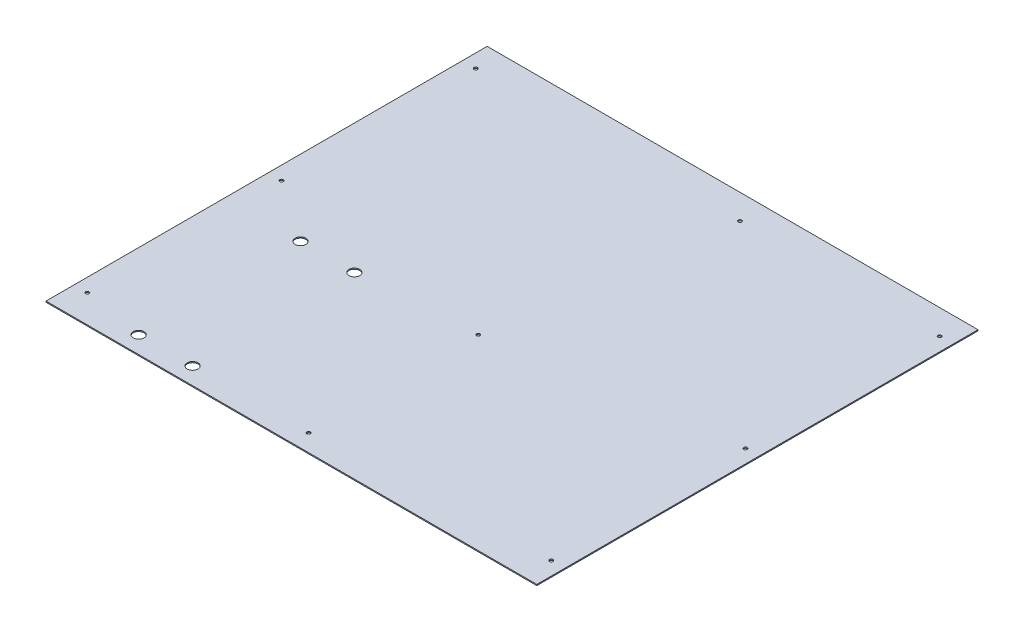
ISO-10303-21;
HEADER;
FILE_DESCRIPTION(('STEP AP214'),'2;1');
FILE_NAME('part.step','',(''),(''),'','','');
FILE_SCHEMA(('AUTOMOTIVE_DESIGN { 1 0 10303 214 1 1 1 1 }'));
ENDSEC;
DATA;
#1=APPLICATION_CONTEXT('core data for automotive mechanical design processes');
#2=APPLICATION_PROTOCOL_DEFINITION('international standard','automotive_design',2000,#1);
#3=PRODUCT_CONTEXT('',#1,'mechanical');
#4=PRODUCT('Part','Part','',(#3));
#5=PRODUCT_RELATED_PRODUCT_CATEGORY('part','',(#4));
#6=PRODUCT_DEFINITION_FORMATION('','',#4);
#7=PRODUCT_DEFINITION_CONTEXT('part definition',#1,'design');
#8=PRODUCT_DEFINITION('design','',#6,#7);
#9=PRODUCT_DEFINITION_SHAPE('','',#8);
#10=(LENGTH_UNIT() NAMED_UNIT(*) SI_UNIT(.MILLI.,.METRE.));
#11=(NAMED_UNIT(*) PLANE_ANGLE_UNIT() SI_UNIT($,.RADIAN.));
#12=(NAMED_UNIT(*) SI_UNIT($,.STERADIAN.) SOLID_ANGLE_UNIT());
#13=UNCERTAINTY_MEASURE_WITH_UNIT(LENGTH_MEASURE(1.E-05),#10,'distance_accuracy_value','');
#14=(GEOMETRIC_REPRESENTATION_CONTEXT(3) GLOBAL_UNCERTAINTY_ASSIGNED_CONTEXT((#13)) GLOBAL_UNIT_ASSIGNED_CONTEXT((#10,
#11,#12)) REPRESENTATION_CONTEXT('',''));
#15=CARTESIAN_POINT('',(0.,0.,0.));
#16=DIRECTION('',(0.,0.,1.));
#17=DIRECTION('',(1.,0.,0.));
#18=AXIS2_PLACEMENT_3D('',#15,#16,#17);
#19=CARTESIAN_POINT('',(227.5,1.,204.5));
#20=DIRECTION('',(-1.,0.,0.));
#21=DIRECTION('',(0.,0.,1.));
#22=AXIS2_PLACEMENT_3D('',#19,#20,#21);
#23=PLANE('',#22);
#24=DIRECTION('',(0.,0.,-1.));
#25=VECTOR('',#24,1.);
#26=CARTESIAN_POINT('',(227.5,0.,204.5));
#27=LINE('',#26,#25);
#28=CARTESIAN_POINT('',(227.5,0.,204.5));
#29=VERTEX_POINT('',#28);
#30=CARTESIAN_POINT('',(227.5,0.,-204.5));
#31=VERTEX_POINT('',#30);
#32=EDGE_CURVE('E100',#29,#31,#27,.T.);
#33=ORIENTED_EDGE('',*,*,#32,.T.);
#34=DIRECTION('',(0.,-1.,0.));
#35=VECTOR('',#34,1.);
#36=CARTESIAN_POINT('',(227.5,1.,-204.5));
#37=LINE('',#36,#35);
#38=CARTESIAN_POINT('',(227.5,1.,-204.5));
#39=VERTEX_POINT('',#38);
#40=EDGE_CURVE('E11',#39,#31,#37,.T.);
#41=ORIENTED_EDGE('',*,*,#40,.F.);
#42=DIRECTION('',(0.,0.,-1.));
#43=VECTOR('',#42,1.);
#44=CARTESIAN_POINT('',(227.5,1.,204.5));
#45=LINE('',#44,#43);
#46=CARTESIAN_POINT('',(227.5,1.,204.5));
#47=VERTEX_POINT('',#46);
#48=EDGE_CURVE('E88',#47,#39,#45,.T.);
#49=ORIENTED_EDGE('',*,*,#48,.F.);
#50=DIRECTION('',(0.,-1.,0.));
#51=VECTOR('',#50,1.);
#52=CARTESIAN_POINT('',(227.5,1.,204.5));
#53=LINE('',#52,#51);
#54=EDGE_CURVE('E96',#47,#29,#53,.T.);
#55=ORIENTED_EDGE('',*,*,#54,.T.);
#56=EDGE_LOOP('',(#33,#41,#49,#55));
#57=FACE_BOUND('',#56,.T.);
#58=ADVANCED_FACE('F37',(#57),#23,.F.);
#59=CARTESIAN_POINT('',(-227.5,1.,-204.5));
#60=DIRECTION('',(0.,0.,1.));
#61=DIRECTION('',(1.,0.,0.));
#62=AXIS2_PLACEMENT_3D('',#59,#60,#61);
#63=PLANE('',#62);
#64=DIRECTION('',(-1.,0.,0.));
#65=VECTOR('',#64,1.);
#66=CARTESIAN_POINT('',(-227.5,0.,-204.5));
#67=LINE('',#66,#65);
#68=CARTESIAN_POINT('',(-227.5,0.,-204.5));
#69=VERTEX_POINT('',#68);
#70=EDGE_CURVE('E92',#31,#69,#67,.T.);
#71=ORIENTED_EDGE('',*,*,#70,.T.);
#72=DIRECTION('',(0.,-1.,0.));
#73=VECTOR('',#72,1.);
#74=CARTESIAN_POINT('',(-227.5,1.,-204.5));
#75=LINE('',#74,#73);
#76=CARTESIAN_POINT('',(-227.5,1.,-204.5));
#77=VERTEX_POINT('',#76);
#78=EDGE_CURVE('E45',#77,#69,#75,.T.);
#79=ORIENTED_EDGE('',*,*,#78,.F.);
#80=DIRECTION('',(-1.,0.,0.));
#81=VECTOR('',#80,1.);
#82=CARTESIAN_POINT('',(-227.5,1.,-204.5));
#83=LINE('',#82,#81);
#84=EDGE_CURVE('E83',#39,#77,#83,.T.);
#85=ORIENTED_EDGE('',*,*,#84,.F.);
#86=ORIENTED_EDGE('',*,*,#40,.T.);
#87=EDGE_LOOP('',(#71,#79,#85,#86));
#88=FACE_BOUND('',#87,.T.);
#89=ADVANCED_FACE('F91',(#88),#63,.F.);
#90=CARTESIAN_POINT('',(-227.5,1.,204.5));
#91=DIRECTION('',(1.,0.,0.));
#92=DIRECTION('',(0.,0.,-1.));
#93=AXIS2_PLACEMENT_3D('',#90,#91,#92);
#94=PLANE('',#93);
#95=DIRECTION('',(0.,0.,1.));
#96=VECTOR('',#95,1.);
#97=CARTESIAN_POINT('',(-227.5,0.,204.5));
#98=LINE('',#97,#96);
#99=CARTESIAN_POINT('',(-227.5,0.,204.5));
#100=VERTEX_POINT('',#99);
#101=EDGE_CURVE('E70',#69,#100,#98,.T.);
#102=ORIENTED_EDGE('',*,*,#101,.T.);
#103=DIRECTION('',(0.,-1.,0.));
#104=VECTOR('',#103,1.);
#105=CARTESIAN_POINT('',(-227.5,1.,204.5));
#106=LINE('',#105,#104);
#107=CARTESIAN_POINT('',(-227.5,1.,204.5));
#108=VERTEX_POINT('',#107);
#109=EDGE_CURVE('E93',#108,#100,#106,.T.);
#110=ORIENTED_EDGE('',*,*,#109,.F.);
#111=DIRECTION('',(0.,0.,1.));
#112=VECTOR('',#111,1.);
#113=CARTESIAN_POINT('',(-227.5,1.,204.5));
#114=LINE('',#113,#112);
#115=EDGE_CURVE('E86',#77,#108,#114,.T.);
#116=ORIENTED_EDGE('',*,*,#115,.F.);
#117=ORIENTED_EDGE('',*,*,#78,.T.);
#118=EDGE_LOOP('',(#102,#110,#116,#117));
#119=FACE_BOUND('',#118,.T.);
#120=ADVANCED_FACE('F94',(#119),#94,.F.);
#121=CARTESIAN_POINT('',(-227.5,1.,204.5));
#122=DIRECTION('',(0.,0.,-1.));
#123=DIRECTION('',(-1.,0.,0.));
#124=AXIS2_PLACEMENT_3D('',#121,#122,#123);
#125=PLANE('',#124);
#126=DIRECTION('',(1.,0.,0.));
#127=VECTOR('',#126,1.);
#128=CARTESIAN_POINT('',(-227.5,0.,204.5));
#129=LINE('',#128,#127);
#130=EDGE_CURVE('E76',#100,#29,#129,.T.);
#131=ORIENTED_EDGE('',*,*,#130,.T.);
#132=ORIENTED_EDGE('',*,*,#54,.F.);
#133=DIRECTION('',(1.,0.,0.));
#134=VECTOR('',#133,1.);
#135=CARTESIAN_POINT('',(-227.5,1.,204.5));
#136=LINE('',#135,#134);
#137=EDGE_CURVE('E53',#108,#47,#136,.T.);
#138=ORIENTED_EDGE('',*,*,#137,.F.);
#139=ORIENTED_EDGE('',*,*,#109,.T.);
#140=EDGE_LOOP('',(#131,#132,#138,#139));
#141=FACE_BOUND('',#140,.T.);
#142=ADVANCED_FACE('F108',(#141),#125,.F.);
#143=CARTESIAN_POINT('',(0.,1.,0.));
#144=DIRECTION('',(0.,-1.,0.));
#145=DIRECTION('',(0.,0.,-1.));
#146=AXIS2_PLACEMENT_3D('',#143,#144,#145);
#147=PLANE('',#146);
#148=CARTESIAN_POINT('',(29.9999999999999,1.,-181.4));
#149=DIRECTION('',(0.,-1.,0.));
#150=DIRECTION('',(0.,0.,-1.));
#151=AXIS2_PLACEMENT_3D('',#148,#149,#150);
#152=CIRCLE('',#151,1.59999999999999);
#153=CARTESIAN_POINT('',(29.9999999999999,1.,-183.));
#154=VERTEX_POINT('',#153);
#155=EDGE_CURVE('E185',#154,#154,#152,.F.);
#156=ORIENTED_EDGE('',*,*,#155,.F.);
#157=EDGE_LOOP('',(#156));
#158=FACE_BOUND('',#157,.T.);
#159=CARTESIAN_POINT('',(0.,1.,188.6));
#160=DIRECTION('',(0.,-1.,0.));
#161=DIRECTION('',(0.,0.,-1.));
#162=AXIS2_PLACEMENT_3D('',#159,#160,#161);
#163=CIRCLE('',#162,1.59999999999999);
#164=CARTESIAN_POINT('',(0.,1.,187.));
#165=VERTEX_POINT('',#164);
#166=EDGE_CURVE('E179',#165,#165,#163,.F.);
#167=ORIENTED_EDGE('',*,*,#166,.F.);
#168=EDGE_LOOP('',(#167));
#169=FACE_BOUND('',#168,.T.);
#170=CARTESIAN_POINT('',(215.,1.,-1.39999999999992));
#171=DIRECTION('',(0.,-1.,0.));
#172=DIRECTION('',(0.,0.,-1.));
#173=AXIS2_PLACEMENT_3D('',#170,#171,#172);
#174=CIRCLE('',#173,1.59999999999999);
#175=CARTESIAN_POINT('',(215.,1.,-2.99999999999991));
#176=VERTEX_POINT('',#175);
#177=EDGE_CURVE('E173',#176,#176,#174,.F.);
#178=ORIENTED_EDGE('',*,*,#177,.F.);
#179=EDGE_LOOP('',(#178));
#180=FACE_BOUND('',#179,.T.);
#181=CARTESIAN_POINT('',(-215.,1.,-1.40000000000001));
#182=DIRECTION('',(0.,-1.,0.));
#183=DIRECTION('',(0.,0.,-1.));
#184=AXIS2_PLACEMENT_3D('',#181,#182,#183);
#185=CIRCLE('',#184,1.59999999999999);
#186=CARTESIAN_POINT('',(-215.,1.,-3.));
#187=VERTEX_POINT('',#186);
#188=EDGE_CURVE('E167',#187,#187,#185,.F.);
#189=ORIENTED_EDGE('',*,*,#188,.F.);
#190=EDGE_LOOP('',(#189));
#191=FACE_BOUND('',#190,.T.);
#192=CARTESIAN_POINT('',(-157.5,1.,188.6));
#193=DIRECTION('',(0.,-1.,0.));
#194=DIRECTION('',(0.,0.,-1.));
#195=AXIS2_PLACEMENT_3D('',#192,#193,#194);
#196=CIRCLE('',#195,4.99999999999999);
#197=CARTESIAN_POINT('',(-157.5,1.,183.6));
#198=VERTEX_POINT('',#197);
#199=EDGE_CURVE('E161',#198,#198,#196,.F.);
#200=ORIENTED_EDGE('',*,*,#199,.F.);
#201=EDGE_LOOP('',(#200));
#202=FACE_BOUND('',#201,.T.);
#203=CARTESIAN_POINT('',(-107.5,1.,188.6));
#204=DIRECTION('',(0.,-1.,0.));
#205=DIRECTION('',(0.,0.,-1.));
#206=AXIS2_PLACEMENT_3D('',#203,#204,#205);
#207=CIRCLE('',#206,5.00000000000001);
#208=CARTESIAN_POINT('',(-107.5,1.,183.6));
#209=VERTEX_POINT('',#208);
#210=EDGE_CURVE('E155',#209,#209,#207,.F.);
#211=ORIENTED_EDGE('',*,*,#210,.F.);
#212=EDGE_LOOP('',(#211));
#213=FACE_BOUND('',#212,.T.);
#214=CARTESIAN_POINT('',(-107.5,1.,38.6));
#215=DIRECTION('',(0.,-1.,0.));
#216=DIRECTION('',(0.,0.,-1.));
#217=AXIS2_PLACEMENT_3D('',#214,#215,#216);
#218=CIRCLE('',#217,5.00000000000001);
#219=CARTESIAN_POINT('',(-107.5,1.,33.6));
#220=VERTEX_POINT('',#219);
#221=EDGE_CURVE('E149',#220,#220,#218,.F.);
#222=ORIENTED_EDGE('',*,*,#221,.F.);
#223=EDGE_LOOP('',(#222));
#224=FACE_BOUND('',#223,.T.);
#225=CARTESIAN_POINT('',(-157.5,1.,38.6));
#226=DIRECTION('',(0.,-1.,0.));
#227=DIRECTION('',(0.,0.,-1.));
#228=AXIS2_PLACEMENT_3D('',#225,#226,#227);
#229=CIRCLE('',#228,4.99999999999999);
#230=CARTESIAN_POINT('',(-157.5,1.,33.6));
#231=VERTEX_POINT('',#230);
#232=EDGE_CURVE('E143',#231,#231,#229,.F.);
#233=ORIENTED_EDGE('',*,*,#232,.F.);
#234=EDGE_LOOP('',(#233));
#235=FACE_BOUND('',#234,.T.);
#236=CARTESIAN_POINT('',(0.,1.,31.25));
#237=DIRECTION('',(0.,-1.,0.));
#238=DIRECTION('',(0.,0.,-1.));
#239=AXIS2_PLACEMENT_3D('',#236,#237,#238);
#240=CIRCLE('',#239,1.6);
#241=CARTESIAN_POINT('',(0.,1.,29.65));
#242=VERTEX_POINT('',#241);
#243=EDGE_CURVE('E137',#242,#242,#240,.F.);
#244=ORIENTED_EDGE('',*,*,#243,.F.);
#245=EDGE_LOOP('',(#244));
#246=FACE_BOUND('',#245,.T.);
#247=CARTESIAN_POINT('',(215.,1.,178.6));
#248=DIRECTION('',(0.,-1.,0.));
#249=DIRECTION('',(0.,0.,-1.));
#250=AXIS2_PLACEMENT_3D('',#247,#248,#249);
#251=CIRCLE('',#250,1.59999999999999);
#252=CARTESIAN_POINT('',(215.,1.,177.));
#253=VERTEX_POINT('',#252);
#254=EDGE_CURVE('E131',#253,#253,#251,.F.);
#255=ORIENTED_EDGE('',*,*,#254,.F.);
#256=EDGE_LOOP('',(#255));
#257=FACE_BOUND('',#256,.T.);
#258=CARTESIAN_POINT('',(215.,1.,-181.4));
#259=DIRECTION('',(0.,-1.,0.));
#260=DIRECTION('',(0.,0.,-1.));
#261=AXIS2_PLACEMENT_3D('',#258,#259,#260);
#262=CIRCLE('',#261,1.59999999999999);
#263=CARTESIAN_POINT('',(215.,1.,-183.));
#264=VERTEX_POINT('',#263);
#265=EDGE_CURVE('E125',#264,#264,#262,.F.);
#266=ORIENTED_EDGE('',*,*,#265,.F.);
#267=EDGE_LOOP('',(#266));
#268=FACE_BOUND('',#267,.T.);
#269=CARTESIAN_POINT('',(-215.,1.,-181.4));
#270=DIRECTION('',(0.,-1.,0.));
#271=DIRECTION('',(0.,0.,-1.));
#272=AXIS2_PLACEMENT_3D('',#269,#270,#271);
#273=CIRCLE('',#272,1.59999999999999);
#274=CARTESIAN_POINT('',(-215.,1.,-183.));
#275=VERTEX_POINT('',#274);
#276=EDGE_CURVE('E119',#275,#275,#273,.F.);
#277=ORIENTED_EDGE('',*,*,#276,.F.);
#278=EDGE_LOOP('',(#277));
#279=FACE_BOUND('',#278,.T.);
#280=CARTESIAN_POINT('',(-215.,1.,178.6));
#281=DIRECTION('',(0.,-1.,0.));
#282=DIRECTION('',(0.,0.,-1.));
#283=AXIS2_PLACEMENT_3D('',#280,#281,#282);
#284=CIRCLE('',#283,1.59999999999999);
#285=CARTESIAN_POINT('',(-215.,1.,177.));
#286=VERTEX_POINT('',#285);
#287=EDGE_CURVE('E103',#286,#286,#284,.F.);
#288=ORIENTED_EDGE('',*,*,#287,.F.);
#289=EDGE_LOOP('',(#288));
#290=FACE_BOUND('',#289,.T.);
#291=ORIENTED_EDGE('',*,*,#48,.T.);
#292=ORIENTED_EDGE('',*,*,#84,.T.);
#293=ORIENTED_EDGE('',*,*,#115,.T.);
#294=ORIENTED_EDGE('',*,*,#137,.T.);
#295=EDGE_LOOP('',(#291,#292,#293,#294));
#296=FACE_BOUND('',#295,.T.);
#297=ADVANCED_FACE('F84',(#158,#169,#180,#191,#202,#213,#224,#235,#246,#257,#268,#279,#290,
#296),#147,.F.);
#298=CARTESIAN_POINT('',(0.,0.,0.));
#299=DIRECTION('',(0.,-1.,0.));
#300=DIRECTION('',(0.,0.,-1.));
#301=AXIS2_PLACEMENT_3D('',#298,#299,#300);
#302=PLANE('',#301);
#303=CARTESIAN_POINT('',(29.9999999999999,0.,-181.4));
#304=DIRECTION('',(0.,-1.,0.));
#305=DIRECTION('',(0.,0.,-1.));
#306=AXIS2_PLACEMENT_3D('',#303,#304,#305);
#307=CIRCLE('',#306,1.59999999999999);
#308=CARTESIAN_POINT('',(29.9999999999999,0.,-183.));
#309=VERTEX_POINT('',#308);
#310=EDGE_CURVE('E188',#309,#309,#307,.T.);
#311=ORIENTED_EDGE('',*,*,#310,.F.);
#312=EDGE_LOOP('',(#311));
#313=FACE_BOUND('',#312,.T.);
#314=CARTESIAN_POINT('',(0.,0.,188.6));
#315=DIRECTION('',(0.,-1.,0.));
#316=DIRECTION('',(0.,0.,-1.));
#317=AXIS2_PLACEMENT_3D('',#314,#315,#316);
#318=CIRCLE('',#317,1.59999999999999);
#319=CARTESIAN_POINT('',(0.,0.,187.));
#320=VERTEX_POINT('',#319);
#321=EDGE_CURVE('E182',#320,#320,#318,.T.);
#322=ORIENTED_EDGE('',*,*,#321,.F.);
#323=EDGE_LOOP('',(#322));
#324=FACE_BOUND('',#323,.T.);
#325=CARTESIAN_POINT('',(215.,0.,-1.39999999999992));
#326=DIRECTION('',(0.,-1.,0.));
#327=DIRECTION('',(0.,0.,-1.));
#328=AXIS2_PLACEMENT_3D('',#325,#326,#327);
#329=CIRCLE('',#328,1.59999999999999);
#330=CARTESIAN_POINT('',(215.,0.,-2.99999999999991));
#331=VERTEX_POINT('',#330);
#332=EDGE_CURVE('E176',#331,#331,#329,.T.);
#333=ORIENTED_EDGE('',*,*,#332,.F.);
#334=EDGE_LOOP('',(#333));
#335=FACE_BOUND('',#334,.T.);
#336=CARTESIAN_POINT('',(-215.,0.,-1.40000000000001));
#337=DIRECTION('',(0.,-1.,0.));
#338=DIRECTION('',(0.,0.,-1.));
#339=AXIS2_PLACEMENT_3D('',#336,#337,#338);
#340=CIRCLE('',#339,1.59999999999999);
#341=CARTESIAN_POINT('',(-215.,0.,-3.));
#342=VERTEX_POINT('',#341);
#343=EDGE_CURVE('E170',#342,#342,#340,.T.);
#344=ORIENTED_EDGE('',*,*,#343,.F.);
#345=EDGE_LOOP('',(#344));
#346=FACE_BOUND('',#345,.T.);
#347=CARTESIAN_POINT('',(-157.5,0.,188.6));
#348=DIRECTION('',(0.,-1.,0.));
#349=DIRECTION('',(0.,0.,-1.));
#350=AXIS2_PLACEMENT_3D('',#347,#348,#349);
#351=CIRCLE('',#350,4.99999999999999);
#352=CARTESIAN_POINT('',(-157.5,0.,183.6));
#353=VERTEX_POINT('',#352);
#354=EDGE_CURVE('E164',#353,#353,#351,.T.);
#355=ORIENTED_EDGE('',*,*,#354,.F.);
#356=EDGE_LOOP('',(#355));
#357=FACE_BOUND('',#356,.T.);
#358=CARTESIAN_POINT('',(-107.5,0.,188.6));
#359=DIRECTION('',(0.,-1.,0.));
#360=DIRECTION('',(0.,0.,-1.));
#361=AXIS2_PLACEMENT_3D('',#358,#359,#360);
#362=CIRCLE('',#361,5.00000000000001);
#363=CARTESIAN_POINT('',(-107.5,0.,183.6));
#364=VERTEX_POINT('',#363);
#365=EDGE_CURVE('E158',#364,#364,#362,.T.);
#366=ORIENTED_EDGE('',*,*,#365,.F.);
#367=EDGE_LOOP('',(#366));
#368=FACE_BOUND('',#367,.T.);
#369=CARTESIAN_POINT('',(-107.5,0.,38.6));
#370=DIRECTION('',(0.,-1.,0.));
#371=DIRECTION('',(0.,0.,-1.));
#372=AXIS2_PLACEMENT_3D('',#369,#370,#371);
#373=CIRCLE('',#372,5.00000000000001);
#374=CARTESIAN_POINT('',(-107.5,0.,33.6));
#375=VERTEX_POINT('',#374);
#376=EDGE_CURVE('E152',#375,#375,#373,.T.);
#377=ORIENTED_EDGE('',*,*,#376,.F.);
#378=EDGE_LOOP('',(#377));
#379=FACE_BOUND('',#378,.T.);
#380=CARTESIAN_POINT('',(-157.5,0.,38.6));
#381=DIRECTION('',(0.,-1.,0.));
#382=DIRECTION('',(0.,0.,-1.));
#383=AXIS2_PLACEMENT_3D('',#380,#381,#382);
#384=CIRCLE('',#383,4.99999999999999);
#385=CARTESIAN_POINT('',(-157.5,0.,33.6));
#386=VERTEX_POINT('',#385);
#387=EDGE_CURVE('E146',#386,#386,#384,.T.);
#388=ORIENTED_EDGE('',*,*,#387,.F.);
#389=EDGE_LOOP('',(#388));
#390=FACE_BOUND('',#389,.T.);
#391=CARTESIAN_POINT('',(0.,0.,31.25));
#392=DIRECTION('',(0.,-1.,0.));
#393=DIRECTION('',(0.,0.,-1.));
#394=AXIS2_PLACEMENT_3D('',#391,#392,#393);
#395=CIRCLE('',#394,1.6);
#396=CARTESIAN_POINT('',(0.,0.,29.65));
#397=VERTEX_POINT('',#396);
#398=EDGE_CURVE('E140',#397,#397,#395,.T.);
#399=ORIENTED_EDGE('',*,*,#398,.F.);
#400=EDGE_LOOP('',(#399));
#401=FACE_BOUND('',#400,.T.);
#402=CARTESIAN_POINT('',(215.,0.,178.6));
#403=DIRECTION('',(0.,-1.,0.));
#404=DIRECTION('',(0.,0.,-1.));
#405=AXIS2_PLACEMENT_3D('',#402,#403,#404);
#406=CIRCLE('',#405,1.59999999999999);
#407=CARTESIAN_POINT('',(215.,0.,177.));
#408=VERTEX_POINT('',#407);
#409=EDGE_CURVE('E134',#408,#408,#406,.T.);
#410=ORIENTED_EDGE('',*,*,#409,.F.);
#411=EDGE_LOOP('',(#410));
#412=FACE_BOUND('',#411,.T.);
#413=CARTESIAN_POINT('',(215.,0.,-181.4));
#414=DIRECTION('',(0.,-1.,0.));
#415=DIRECTION('',(0.,0.,-1.));
#416=AXIS2_PLACEMENT_3D('',#413,#414,#415);
#417=CIRCLE('',#416,1.59999999999999);
#418=CARTESIAN_POINT('',(215.,0.,-183.));
#419=VERTEX_POINT('',#418);
#420=EDGE_CURVE('E128',#419,#419,#417,.T.);
#421=ORIENTED_EDGE('',*,*,#420,.F.);
#422=EDGE_LOOP('',(#421));
#423=FACE_BOUND('',#422,.T.);
#424=CARTESIAN_POINT('',(-215.,0.,-181.4));
#425=DIRECTION('',(0.,-1.,0.));
#426=DIRECTION('',(0.,0.,-1.));
#427=AXIS2_PLACEMENT_3D('',#424,#425,#426);
#428=CIRCLE('',#427,1.59999999999999);
#429=CARTESIAN_POINT('',(-215.,0.,-183.));
#430=VERTEX_POINT('',#429);
#431=EDGE_CURVE('E122',#430,#430,#428,.T.);
#432=ORIENTED_EDGE('',*,*,#431,.F.);
#433=EDGE_LOOP('',(#432));
#434=FACE_BOUND('',#433,.T.);
#435=CARTESIAN_POINT('',(-215.,0.,178.6));
#436=DIRECTION('',(0.,-1.,0.));
#437=DIRECTION('',(0.,0.,-1.));
#438=AXIS2_PLACEMENT_3D('',#435,#436,#437);
#439=CIRCLE('',#438,1.59999999999999);
#440=CARTESIAN_POINT('',(-215.,0.,177.));
#441=VERTEX_POINT('',#440);
#442=EDGE_CURVE('E116',#441,#441,#439,.T.);
#443=ORIENTED_EDGE('',*,*,#442,.F.);
#444=EDGE_LOOP('',(#443));
#445=FACE_BOUND('',#444,.T.);
#446=ORIENTED_EDGE('',*,*,#32,.F.);
#447=ORIENTED_EDGE('',*,*,#130,.F.);
#448=ORIENTED_EDGE('',*,*,#101,.F.);
#449=ORIENTED_EDGE('',*,*,#70,.F.);
#450=EDGE_LOOP('',(#446,#447,#448,#449));
#451=FACE_BOUND('',#450,.T.);
#452=ADVANCED_FACE('F111',(#313,#324,#335,#346,#357,#368,#379,#390,#401,#412,#423,#434,#445,
#451),#302,.T.);
#453=CARTESIAN_POINT('',(-215.,1.001,178.6));
#454=DIRECTION('',(0.,-1.,0.));
#455=DIRECTION('',(0.,0.,-1.));
#456=AXIS2_PLACEMENT_3D('',#453,#454,#455);
#457=CYLINDRICAL_SURFACE('',#456,1.59999999999999);
#458=ORIENTED_EDGE('',*,*,#442,.T.);
#459=EDGE_LOOP('',(#458));
#460=FACE_BOUND('',#459,.T.);
#461=ORIENTED_EDGE('',*,*,#287,.T.);
#462=EDGE_LOOP('',(#461));
#463=FACE_BOUND('',#462,.T.);
#464=ADVANCED_FACE('F197',(#460,#463),#457,.F.);
#465=CARTESIAN_POINT('',(-215.,1.001,-181.4));
#466=DIRECTION('',(0.,-1.,0.));
#467=DIRECTION('',(0.,0.,-1.));
#468=AXIS2_PLACEMENT_3D('',#465,#466,#467);
#469=CYLINDRICAL_SURFACE('',#468,1.59999999999999);
#470=ORIENTED_EDGE('',*,*,#431,.T.);
#471=EDGE_LOOP('',(#470));
#472=FACE_BOUND('',#471,.T.);
#473=ORIENTED_EDGE('',*,*,#276,.T.);
#474=EDGE_LOOP('',(#473));
#475=FACE_BOUND('',#474,.T.);
#476=ADVANCED_FACE('F225',(#472,#475),#469,.F.);
#477=CARTESIAN_POINT('',(215.,1.001,-181.4));
#478=DIRECTION('',(0.,-1.,0.));
#479=DIRECTION('',(0.,0.,-1.));
#480=AXIS2_PLACEMENT_3D('',#477,#478,#479);
#481=CYLINDRICAL_SURFACE('',#480,1.59999999999999);
#482=ORIENTED_EDGE('',*,*,#420,.T.);
#483=EDGE_LOOP('',(#482));
#484=FACE_BOUND('',#483,.T.);
#485=ORIENTED_EDGE('',*,*,#265,.T.);
#486=EDGE_LOOP('',(#485));
#487=FACE_BOUND('',#486,.T.);
#488=ADVANCED_FACE('F269',(#484,#487),#481,.F.);
#489=CARTESIAN_POINT('',(215.,1.001,178.6));
#490=DIRECTION('',(0.,-1.,0.));
#491=DIRECTION('',(0.,0.,-1.));
#492=AXIS2_PLACEMENT_3D('',#489,#490,#491);
#493=CYLINDRICAL_SURFACE('',#492,1.59999999999999);
#494=ORIENTED_EDGE('',*,*,#409,.T.);
#495=EDGE_LOOP('',(#494));
#496=FACE_BOUND('',#495,.T.);
#497=ORIENTED_EDGE('',*,*,#254,.T.);
#498=EDGE_LOOP('',(#497));
#499=FACE_BOUND('',#498,.T.);
#500=ADVANCED_FACE('F279',(#496,#499),#493,.F.);
#501=CARTESIAN_POINT('',(0.,1.001,31.25));
#502=DIRECTION('',(0.,-1.,0.));
#503=DIRECTION('',(0.,0.,-1.));
#504=AXIS2_PLACEMENT_3D('',#501,#502,#503);
#505=CYLINDRICAL_SURFACE('',#504,1.6);
#506=ORIENTED_EDGE('',*,*,#398,.T.);
#507=EDGE_LOOP('',(#506));
#508=FACE_BOUND('',#507,.T.);
#509=ORIENTED_EDGE('',*,*,#243,.T.);
#510=EDGE_LOOP('',(#509));
#511=FACE_BOUND('',#510,.T.);
#512=ADVANCED_FACE('F289',(#508,#511),#505,.F.);
#513=CARTESIAN_POINT('',(-157.5,1.001,38.6));
#514=DIRECTION('',(0.,-1.,0.));
#515=DIRECTION('',(0.,0.,-1.));
#516=AXIS2_PLACEMENT_3D('',#513,#514,#515);
#517=CYLINDRICAL_SURFACE('',#516,4.99999999999999);
#518=ORIENTED_EDGE('',*,*,#387,.T.);
#519=EDGE_LOOP('',(#518));
#520=FACE_BOUND('',#519,.T.);
#521=ORIENTED_EDGE('',*,*,#232,.T.);
#522=EDGE_LOOP('',(#521));
#523=FACE_BOUND('',#522,.T.);
#524=ADVANCED_FACE('F299',(#520,#523),#517,.F.);
#525=CARTESIAN_POINT('',(-107.5,1.001,38.6));
#526=DIRECTION('',(0.,-1.,0.));
#527=DIRECTION('',(0.,0.,-1.));
#528=AXIS2_PLACEMENT_3D('',#525,#526,#527);
#529=CYLINDRICAL_SURFACE('',#528,5.00000000000001);
#530=ORIENTED_EDGE('',*,*,#376,.T.);
#531=EDGE_LOOP('',(#530));
#532=FACE_BOUND('',#531,.T.);
#533=ORIENTED_EDGE('',*,*,#221,.T.);
#534=EDGE_LOOP('',(#533));
#535=FACE_BOUND('',#534,.T.);
#536=ADVANCED_FACE('F309',(#532,#535),#529,.F.);
#537=CARTESIAN_POINT('',(-107.5,1.001,188.6));
#538=DIRECTION('',(0.,-1.,0.));
#539=DIRECTION('',(0.,0.,-1.));
#540=AXIS2_PLACEMENT_3D('',#537,#538,#539);
#541=CYLINDRICAL_SURFACE('',#540,5.00000000000001);
#542=ORIENTED_EDGE('',*,*,#365,.T.);
#543=EDGE_LOOP('',(#542));
#544=FACE_BOUND('',#543,.T.);
#545=ORIENTED_EDGE('',*,*,#210,.T.);
#546=EDGE_LOOP('',(#545));
#547=FACE_BOUND('',#546,.T.);
#548=ADVANCED_FACE('F319',(#544,#547),#541,.F.);
#549=CARTESIAN_POINT('',(-157.5,1.001,188.6));
#550=DIRECTION('',(0.,-1.,0.));
#551=DIRECTION('',(0.,0.,-1.));
#552=AXIS2_PLACEMENT_3D('',#549,#550,#551);
#553=CYLINDRICAL_SURFACE('',#552,4.99999999999999);
#554=ORIENTED_EDGE('',*,*,#354,.T.);
#555=EDGE_LOOP('',(#554));
#556=FACE_BOUND('',#555,.T.);
#557=ORIENTED_EDGE('',*,*,#199,.T.);
#558=EDGE_LOOP('',(#557));
#559=FACE_BOUND('',#558,.T.);
#560=ADVANCED_FACE('F329',(#556,#559),#553,.F.);
#561=CARTESIAN_POINT('',(-215.,1.001,-1.40000000000001));
#562=DIRECTION('',(0.,-1.,0.));
#563=DIRECTION('',(0.,0.,-1.));
#564=AXIS2_PLACEMENT_3D('',#561,#562,#563);
#565=CYLINDRICAL_SURFACE('',#564,1.59999999999999);
#566=ORIENTED_EDGE('',*,*,#343,.T.);
#567=EDGE_LOOP('',(#566));
#568=FACE_BOUND('',#567,.T.);
#569=ORIENTED_EDGE('',*,*,#188,.T.);
#570=EDGE_LOOP('',(#569));
#571=FACE_BOUND('',#570,.T.);
#572=ADVANCED_FACE('F338',(#568,#571),#565,.F.);
#573=CARTESIAN_POINT('',(215.,1.001,-1.39999999999992));
#574=DIRECTION('',(0.,-1.,0.));
#575=DIRECTION('',(0.,0.,-1.));
#576=AXIS2_PLACEMENT_3D('',#573,#574,#575);
#577=CYLINDRICAL_SURFACE('',#576,1.59999999999999);
#578=ORIENTED_EDGE('',*,*,#332,.T.);
#579=EDGE_LOOP('',(#578));
#580=FACE_BOUND('',#579,.T.);
#581=ORIENTED_EDGE('',*,*,#177,.T.);
#582=EDGE_LOOP('',(#581));
#583=FACE_BOUND('',#582,.T.);
#584=ADVANCED_FACE('F357',(#580,#583),#577,.F.);
#585=CARTESIAN_POINT('',(0.,1.001,188.6));
#586=DIRECTION('',(0.,-1.,0.));
#587=DIRECTION('',(0.,0.,-1.));
#588=AXIS2_PLACEMENT_3D('',#585,#586,#587);
#589=CYLINDRICAL_SURFACE('',#588,1.59999999999999);
#590=ORIENTED_EDGE('',*,*,#321,.T.);
#591=EDGE_LOOP('',(#590));
#592=FACE_BOUND('',#591,.T.);
#593=ORIENTED_EDGE('',*,*,#166,.T.);
#594=EDGE_LOOP('',(#593));
#595=FACE_BOUND('',#594,.T.);
#596=ADVANCED_FACE('F367',(#592,#595),#589,.F.);
#597=CARTESIAN_POINT('',(29.9999999999999,1.001,-181.4));
#598=DIRECTION('',(0.,-1.,0.));
#599=DIRECTION('',(0.,0.,-1.));
#600=AXIS2_PLACEMENT_3D('',#597,#598,#599);
#601=CYLINDRICAL_SURFACE('',#600,1.59999999999999);
#602=ORIENTED_EDGE('',*,*,#310,.T.);
#603=EDGE_LOOP('',(#602));
#604=FACE_BOUND('',#603,.T.);
#605=ORIENTED_EDGE('',*,*,#155,.T.);
#606=EDGE_LOOP('',(#605));
#607=FACE_BOUND('',#606,.T.);
#608=ADVANCED_FACE('F192',(#604,#607),#601,.F.);
#609=CLOSED_SHELL('',(#58,#89,#120,#142,#297,#452,#464,#476,#488,#500,#512,#524,#536,#548,#560,
#572,#584,#596,#608));
#610=MANIFOLD_SOLID_BREP('B2',#609);
#611=ADVANCED_BREP_SHAPE_REPRESENTATION('',(#18,#610),#14);
#612=SHAPE_DEFINITION_REPRESENTATION(#9,#611);
ENDSEC;
END-ISO-10303-21;
